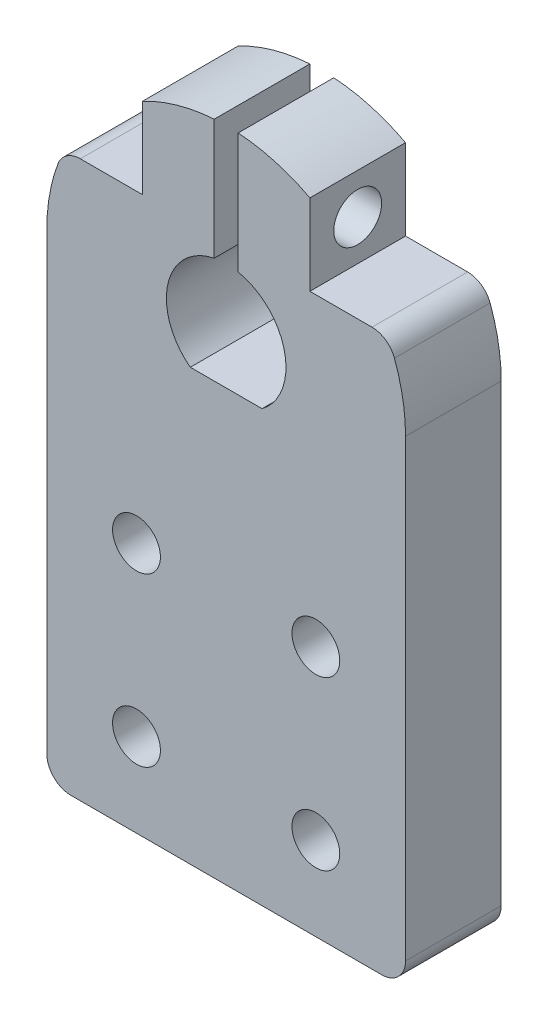
ISO-10303-21;
HEADER;
FILE_DESCRIPTION(('STEP AP214'),'2;1');
FILE_NAME('part.step','',(''),(''),'','','');
FILE_SCHEMA(('AUTOMOTIVE_DESIGN { 1 0 10303 214 1 1 1 1 }'));
ENDSEC;
DATA;
#1=APPLICATION_CONTEXT('core data for automotive mechanical design processes');
#2=APPLICATION_PROTOCOL_DEFINITION('international standard','automotive_design',2000,#1);
#3=PRODUCT_CONTEXT('',#1,'mechanical');
#4=PRODUCT('Part','Part','',(#3));
#5=PRODUCT_RELATED_PRODUCT_CATEGORY('part','',(#4));
#6=PRODUCT_DEFINITION_FORMATION('','',#4);
#7=PRODUCT_DEFINITION_CONTEXT('part definition',#1,'design');
#8=PRODUCT_DEFINITION('design','',#6,#7);
#9=PRODUCT_DEFINITION_SHAPE('','',#8);
#10=(LENGTH_UNIT() NAMED_UNIT(*) SI_UNIT(.MILLI.,.METRE.));
#11=(NAMED_UNIT(*) PLANE_ANGLE_UNIT() SI_UNIT($,.RADIAN.));
#12=(NAMED_UNIT(*) SI_UNIT($,.STERADIAN.) SOLID_ANGLE_UNIT());
#13=UNCERTAINTY_MEASURE_WITH_UNIT(LENGTH_MEASURE(1.E-05),#10,'distance_accuracy_value','');
#14=(GEOMETRIC_REPRESENTATION_CONTEXT(3) GLOBAL_UNCERTAINTY_ASSIGNED_CONTEXT((#13)) GLOBAL_UNIT_ASSIGNED_CONTEXT((#10,
#11,#12)) REPRESENTATION_CONTEXT('',''));
#15=CARTESIAN_POINT('',(0.,0.,0.));
#16=DIRECTION('',(0.,0.,1.));
#17=DIRECTION('',(1.,0.,0.));
#18=AXIS2_PLACEMENT_3D('',#15,#16,#17);
#19=CARTESIAN_POINT('',(0.,0.,8.));
#20=DIRECTION('',(0.,0.,-1.));
#21=DIRECTION('',(-1.,0.,0.));
#22=AXIS2_PLACEMENT_3D('',#19,#20,#21);
#23=CYLINDRICAL_SURFACE('',#22,15.);
#24=CARTESIAN_POINT('',(0.,0.,8.));
#25=DIRECTION('',(0.,0.,1.));
#26=DIRECTION('',(1.,0.,0.));
#27=AXIS2_PLACEMENT_3D('',#24,#25,#26);
#28=CIRCLE('',#27,15.);
#29=CARTESIAN_POINT('',(-14.0726664434428,5.19230769230769,8.));
#30=VERTEX_POINT('',#29);
#31=CARTESIAN_POINT('',(-15.,0.,8.));
#32=VERTEX_POINT('',#31);
#33=EDGE_CURVE('E176',#30,#32,#28,.T.);
#34=ORIENTED_EDGE('',*,*,#33,.F.);
#35=DIRECTION('',(0.,0.,-1.));
#36=VECTOR('',#35,1.);
#37=CARTESIAN_POINT('',(-14.0726664434428,5.19230769230769,8.));
#38=LINE('',#37,#36);
#39=CARTESIAN_POINT('',(-14.0726664434428,5.19230769230769,0.));
#40=VERTEX_POINT('',#39);
#41=EDGE_CURVE('E245',#30,#40,#38,.T.);
#42=ORIENTED_EDGE('',*,*,#41,.T.);
#43=CARTESIAN_POINT('',(0.,0.,0.));
#44=DIRECTION('',(0.,0.,1.));
#45=DIRECTION('',(1.,0.,0.));
#46=AXIS2_PLACEMENT_3D('',#43,#44,#45);
#47=CIRCLE('',#46,15.);
#48=CARTESIAN_POINT('',(-15.,0.,0.));
#49=VERTEX_POINT('',#48);
#50=EDGE_CURVE('E199',#40,#49,#47,.T.);
#51=ORIENTED_EDGE('',*,*,#50,.T.);
#52=DIRECTION('',(0.,0.,-1.));
#53=VECTOR('',#52,1.);
#54=CARTESIAN_POINT('',(-15.,0.,8.));
#55=LINE('',#54,#53);
#56=EDGE_CURVE('E194',#32,#49,#55,.T.);
#57=ORIENTED_EDGE('',*,*,#56,.F.);
#58=EDGE_LOOP('',(#34,#42,#51,#57));
#59=FACE_BOUND('',#58,.T.);
#60=ADVANCED_FACE('F37',(#59),#23,.T.);
#61=CARTESIAN_POINT('',(-15.,-25.,8.));
#62=DIRECTION('',(1.,0.,0.));
#63=DIRECTION('',(0.,1.,0.));
#64=AXIS2_PLACEMENT_3D('',#61,#62,#63);
#65=PLANE('',#64);
#66=DIRECTION('',(0.,-1.,0.));
#67=VECTOR('',#66,1.);
#68=CARTESIAN_POINT('',(-15.,-25.,0.));
#69=LINE('',#68,#67);
#70=CARTESIAN_POINT('',(-15.,-38.,0.));
#71=VERTEX_POINT('',#70);
#72=EDGE_CURVE('E266',#49,#71,#69,.T.);
#73=ORIENTED_EDGE('',*,*,#72,.T.);
#74=DIRECTION('',(0.,0.,-1.));
#75=VECTOR('',#74,1.);
#76=CARTESIAN_POINT('',(-15.,-38.,8.));
#77=LINE('',#76,#75);
#78=CARTESIAN_POINT('',(-15.,-38.,8.));
#79=VERTEX_POINT('',#78);
#80=EDGE_CURVE('E45',#71,#79,#77,.F.);
#81=ORIENTED_EDGE('',*,*,#80,.T.);
#82=DIRECTION('',(0.,-1.,0.));
#83=VECTOR('',#82,1.);
#84=CARTESIAN_POINT('',(-15.,0.,8.));
#85=LINE('',#84,#83);
#86=EDGE_CURVE('E180',#32,#79,#85,.T.);
#87=ORIENTED_EDGE('',*,*,#86,.F.);
#88=ORIENTED_EDGE('',*,*,#56,.T.);
#89=EDGE_LOOP('',(#73,#81,#87,#88));
#90=FACE_BOUND('',#89,.T.);
#91=ADVANCED_FACE('F193',(#90),#65,.F.);
#92=CARTESIAN_POINT('',(-15.,-40.,8.));
#93=DIRECTION('',(0.,1.,0.));
#94=DIRECTION('',(0.,0.,1.));
#95=AXIS2_PLACEMENT_3D('',#92,#93,#94);
#96=PLANE('',#95);
#97=DIRECTION('',(1.,0.,0.));
#98=VECTOR('',#97,1.);
#99=CARTESIAN_POINT('',(-15.,-40.,8.));
#100=LINE('',#99,#98);
#101=CARTESIAN_POINT('',(-13.,-40.,8.));
#102=VERTEX_POINT('',#101);
#103=CARTESIAN_POINT('',(13.,-40.,8.));
#104=VERTEX_POINT('',#103);
#105=EDGE_CURVE('E196',#102,#104,#100,.T.);
#106=ORIENTED_EDGE('',*,*,#105,.F.);
#107=DIRECTION('',(0.,0.,-1.));
#108=VECTOR('',#107,1.);
#109=CARTESIAN_POINT('',(-13.,-40.,8.));
#110=LINE('',#109,#108);
#111=CARTESIAN_POINT('',(-13.,-40.,0.));
#112=VERTEX_POINT('',#111);
#113=EDGE_CURVE('E250',#102,#112,#110,.T.);
#114=ORIENTED_EDGE('',*,*,#113,.T.);
#115=DIRECTION('',(1.,0.,0.));
#116=VECTOR('',#115,1.);
#117=CARTESIAN_POINT('',(-15.,-40.,0.));
#118=LINE('',#117,#116);
#119=CARTESIAN_POINT('',(13.,-40.,0.));
#120=VERTEX_POINT('',#119);
#121=EDGE_CURVE('E258',#112,#120,#118,.T.);
#122=ORIENTED_EDGE('',*,*,#121,.T.);
#123=DIRECTION('',(0.,0.,-1.));
#124=VECTOR('',#123,1.);
#125=CARTESIAN_POINT('',(13.,-40.,8.));
#126=LINE('',#125,#124);
#127=EDGE_CURVE('E248',#120,#104,#126,.F.);
#128=ORIENTED_EDGE('',*,*,#127,.T.);
#129=EDGE_LOOP('',(#106,#114,#122,#128));
#130=FACE_BOUND('',#129,.T.);
#131=ADVANCED_FACE('F257',(#130),#96,.F.);
#132=CARTESIAN_POINT('',(15.,-40.,8.));
#133=DIRECTION('',(-1.,0.,0.));
#134=DIRECTION('',(0.,-1.,0.));
#135=AXIS2_PLACEMENT_3D('',#132,#133,#134);
#136=PLANE('',#135);
#137=DIRECTION('',(0.,1.,0.));
#138=VECTOR('',#137,1.);
#139=CARTESIAN_POINT('',(15.,-40.,8.));
#140=LINE('',#139,#138);
#141=CARTESIAN_POINT('',(15.,-38.,8.));
#142=VERTEX_POINT('',#141);
#143=CARTESIAN_POINT('',(15.,0.,8.));
#144=VERTEX_POINT('',#143);
#145=EDGE_CURVE('E373',#142,#144,#140,.T.);
#146=ORIENTED_EDGE('',*,*,#145,.F.);
#147=DIRECTION('',(0.,0.,-1.));
#148=VECTOR('',#147,1.);
#149=CARTESIAN_POINT('',(15.,-38.,8.));
#150=LINE('',#149,#148);
#151=CARTESIAN_POINT('',(15.,-38.,0.));
#152=VERTEX_POINT('',#151);
#153=EDGE_CURVE('E11',#142,#152,#150,.T.);
#154=ORIENTED_EDGE('',*,*,#153,.T.);
#155=DIRECTION('',(0.,1.,0.));
#156=VECTOR('',#155,1.);
#157=CARTESIAN_POINT('',(15.,-40.,0.));
#158=LINE('',#157,#156);
#159=CARTESIAN_POINT('',(15.,0.,0.));
#160=VERTEX_POINT('',#159);
#161=EDGE_CURVE('E265',#152,#160,#158,.T.);
#162=ORIENTED_EDGE('',*,*,#161,.T.);
#163=DIRECTION('',(0.,0.,-1.));
#164=VECTOR('',#163,1.);
#165=CARTESIAN_POINT('',(15.,0.,8.));
#166=LINE('',#165,#164);
#167=EDGE_CURVE('E202',#144,#160,#166,.T.);
#168=ORIENTED_EDGE('',*,*,#167,.F.);
#169=EDGE_LOOP('',(#146,#154,#162,#168));
#170=FACE_BOUND('',#169,.T.);
#171=ADVANCED_FACE('F390',(#170),#136,.F.);
#172=CARTESIAN_POINT('',(0.,0.,8.));
#173=DIRECTION('',(0.,0.,-1.));
#174=DIRECTION('',(-1.,0.,0.));
#175=AXIS2_PLACEMENT_3D('',#172,#173,#174);
#176=CYLINDRICAL_SURFACE('',#175,15.);
#177=CARTESIAN_POINT('',(0.,0.,0.));
#178=DIRECTION('',(0.,0.,1.));
#179=DIRECTION('',(1.,0.,0.));
#180=AXIS2_PLACEMENT_3D('',#177,#178,#179);
#181=CIRCLE('',#180,15.);
#182=CARTESIAN_POINT('',(14.0726664434428,5.19230769230769,0.));
#183=VERTEX_POINT('',#182);
#184=EDGE_CURVE('E268',#160,#183,#181,.T.);
#185=ORIENTED_EDGE('',*,*,#184,.T.);
#186=DIRECTION('',(0.,0.,-1.));
#187=VECTOR('',#186,1.);
#188=CARTESIAN_POINT('',(14.0726664434428,5.19230769230769,8.));
#189=LINE('',#188,#187);
#190=CARTESIAN_POINT('',(14.0726664434428,5.19230769230769,8.));
#191=VERTEX_POINT('',#190);
#192=EDGE_CURVE('E237',#183,#191,#189,.F.);
#193=ORIENTED_EDGE('',*,*,#192,.T.);
#194=CARTESIAN_POINT('',(0.,0.,8.));
#195=DIRECTION('',(0.,0.,1.));
#196=DIRECTION('',(1.,0.,0.));
#197=AXIS2_PLACEMENT_3D('',#194,#195,#196);
#198=CIRCLE('',#197,15.);
#199=EDGE_CURVE('E375',#144,#191,#198,.T.);
#200=ORIENTED_EDGE('',*,*,#199,.F.);
#201=ORIENTED_EDGE('',*,*,#167,.T.);
#202=EDGE_LOOP('',(#185,#193,#200,#201));
#203=FACE_BOUND('',#202,.T.);
#204=ADVANCED_FACE('F386',(#203),#176,.T.);
#205=CARTESIAN_POINT('',(7.,6.5,8.));
#206=DIRECTION('',(0.,-1.,0.));
#207=DIRECTION('',(0.,0.,-1.));
#208=AXIS2_PLACEMENT_3D('',#205,#206,#207);
#209=PLANE('',#208);
#210=DIRECTION('',(-1.,0.,0.));
#211=VECTOR('',#210,1.);
#212=CARTESIAN_POINT('',(7.,6.5,8.));
#213=LINE('',#212,#211);
#214=CARTESIAN_POINT('',(12.1963109176505,6.5,8.));
#215=VERTEX_POINT('',#214);
#216=CARTESIAN_POINT('',(7.,6.5,8.));
#217=VERTEX_POINT('',#216);
#218=EDGE_CURVE('E377',#215,#217,#213,.T.);
#219=ORIENTED_EDGE('',*,*,#218,.F.);
#220=DIRECTION('',(0.,0.,-1.));
#221=VECTOR('',#220,1.);
#222=CARTESIAN_POINT('',(12.1963109176505,6.5,8.));
#223=LINE('',#222,#221);
#224=CARTESIAN_POINT('',(12.1963109176505,6.5,0.));
#225=VERTEX_POINT('',#224);
#226=EDGE_CURVE('E201',#215,#225,#223,.T.);
#227=ORIENTED_EDGE('',*,*,#226,.T.);
#228=DIRECTION('',(-1.,0.,0.));
#229=VECTOR('',#228,1.);
#230=CARTESIAN_POINT('',(7.,6.5,0.));
#231=LINE('',#230,#229);
#232=CARTESIAN_POINT('',(7.,6.5,0.));
#233=VERTEX_POINT('',#232);
#234=EDGE_CURVE('E275',#225,#233,#231,.T.);
#235=ORIENTED_EDGE('',*,*,#234,.T.);
#236=DIRECTION('',(0.,0.,-1.));
#237=VECTOR('',#236,1.);
#238=CARTESIAN_POINT('',(7.,6.5,8.));
#239=LINE('',#238,#237);
#240=EDGE_CURVE('E208',#217,#233,#239,.T.);
#241=ORIENTED_EDGE('',*,*,#240,.F.);
#242=EDGE_LOOP('',(#219,#227,#235,#241));
#243=FACE_BOUND('',#242,.T.);
#244=ADVANCED_FACE('F380',(#243),#209,.F.);
#245=CARTESIAN_POINT('',(7.,6.5,8.));
#246=DIRECTION('',(-1.,0.,0.));
#247=DIRECTION('',(0.,0.,1.));
#248=AXIS2_PLACEMENT_3D('',#245,#246,#247);
#249=PLANE('',#248);
#250=CARTESIAN_POINT('',(7.,9.8832495807108,4.));
#251=DIRECTION('',(1.,0.,0.));
#252=DIRECTION('',(0.,0.,-1.));
#253=AXIS2_PLACEMENT_3D('',#250,#251,#252);
#254=CIRCLE('',#253,2.);
#255=CARTESIAN_POINT('',(7.,9.8832495807108,2.));
#256=VERTEX_POINT('',#255);
#257=EDGE_CURVE('E216',#256,#256,#254,.T.);
#258=ORIENTED_EDGE('',*,*,#257,.F.);
#259=EDGE_LOOP('',(#258));
#260=FACE_BOUND('',#259,.T.);
#261=DIRECTION('',(0.,1.,0.));
#262=VECTOR('',#261,1.);
#263=CARTESIAN_POINT('',(7.,6.5,0.));
#264=LINE('',#263,#262);
#265=CARTESIAN_POINT('',(7.,13.2664991614216,0.));
#266=VERTEX_POINT('',#265);
#267=EDGE_CURVE('E277',#233,#266,#264,.T.);
#268=ORIENTED_EDGE('',*,*,#267,.T.);
#269=DIRECTION('',(0.,0.,-1.));
#270=VECTOR('',#269,1.);
#271=CARTESIAN_POINT('',(7.,13.2664991614216,8.));
#272=LINE('',#271,#270);
#273=CARTESIAN_POINT('',(7.,13.2664991614216,8.));
#274=VERTEX_POINT('',#273);
#275=EDGE_CURVE('E321',#274,#266,#272,.T.);
#276=ORIENTED_EDGE('',*,*,#275,.F.);
#277=DIRECTION('',(0.,1.,0.));
#278=VECTOR('',#277,1.);
#279=CARTESIAN_POINT('',(7.,6.5,8.));
#280=LINE('',#279,#278);
#281=EDGE_CURVE('E330',#217,#274,#280,.T.);
#282=ORIENTED_EDGE('',*,*,#281,.F.);
#283=ORIENTED_EDGE('',*,*,#240,.T.);
#284=EDGE_LOOP('',(#268,#276,#282,#283));
#285=FACE_BOUND('',#284,.T.);
#286=ADVANCED_FACE('F328',(#260,#285),#249,.F.);
#287=CARTESIAN_POINT('',(0.,0.,8.));
#288=DIRECTION('',(0.,0.,-1.));
#289=DIRECTION('',(-1.,0.,0.));
#290=AXIS2_PLACEMENT_3D('',#287,#288,#289);
#291=CYLINDRICAL_SURFACE('',#290,15.);
#292=CARTESIAN_POINT('',(0.,0.,0.));
#293=DIRECTION('',(0.,0.,1.));
#294=DIRECTION('',(1.,0.,0.));
#295=AXIS2_PLACEMENT_3D('',#292,#293,#294);
#296=CIRCLE('',#295,15.);
#297=CARTESIAN_POINT('',(1.,14.9666295470958,0.));
#298=VERTEX_POINT('',#297);
#299=EDGE_CURVE('E279',#266,#298,#296,.T.);
#300=ORIENTED_EDGE('',*,*,#299,.T.);
#301=DIRECTION('',(0.,0.,-1.));
#302=VECTOR('',#301,1.);
#303=CARTESIAN_POINT('',(1.,14.9666295470958,8.));
#304=LINE('',#303,#302);
#305=CARTESIAN_POINT('',(1.,14.9666295470958,8.));
#306=VERTEX_POINT('',#305);
#307=EDGE_CURVE('E318',#306,#298,#304,.T.);
#308=ORIENTED_EDGE('',*,*,#307,.F.);
#309=CARTESIAN_POINT('',(0.,0.,8.));
#310=DIRECTION('',(0.,0.,1.));
#311=DIRECTION('',(1.,0.,0.));
#312=AXIS2_PLACEMENT_3D('',#309,#310,#311);
#313=CIRCLE('',#312,15.);
#314=EDGE_CURVE('E347',#274,#306,#313,.T.);
#315=ORIENTED_EDGE('',*,*,#314,.F.);
#316=ORIENTED_EDGE('',*,*,#275,.T.);
#317=EDGE_LOOP('',(#300,#308,#315,#316));
#318=FACE_BOUND('',#317,.T.);
#319=ADVANCED_FACE('F338',(#318),#291,.T.);
#320=CARTESIAN_POINT('',(1.,4.89897948556636,8.));
#321=DIRECTION('',(1.,0.,0.));
#322=DIRECTION('',(0.,0.,-1.));
#323=AXIS2_PLACEMENT_3D('',#320,#321,#322);
#324=PLANE('',#323);
#325=CARTESIAN_POINT('',(1.,9.8832495807108,4.));
#326=DIRECTION('',(1.,0.,0.));
#327=DIRECTION('',(0.,0.,-1.));
#328=AXIS2_PLACEMENT_3D('',#325,#326,#327);
#329=CIRCLE('',#328,2.);
#330=CARTESIAN_POINT('',(1.,9.8832495807108,2.));
#331=VERTEX_POINT('',#330);
#332=EDGE_CURVE('E363',#331,#331,#329,.T.);
#333=ORIENTED_EDGE('',*,*,#332,.T.);
#334=EDGE_LOOP('',(#333));
#335=FACE_BOUND('',#334,.T.);
#336=DIRECTION('',(0.,-1.,0.));
#337=VECTOR('',#336,1.);
#338=CARTESIAN_POINT('',(1.,4.89897948556636,0.));
#339=LINE('',#338,#337);
#340=CARTESIAN_POINT('',(1.,4.89897948556636,0.));
#341=VERTEX_POINT('',#340);
#342=EDGE_CURVE('E281',#298,#341,#339,.T.);
#343=ORIENTED_EDGE('',*,*,#342,.T.);
#344=DIRECTION('',(0.,0.,-1.));
#345=VECTOR('',#344,1.);
#346=CARTESIAN_POINT('',(1.,4.89897948556636,8.));
#347=LINE('',#346,#345);
#348=CARTESIAN_POINT('',(1.,4.89897948556636,8.));
#349=VERTEX_POINT('',#348);
#350=EDGE_CURVE('E315',#349,#341,#347,.T.);
#351=ORIENTED_EDGE('',*,*,#350,.F.);
#352=DIRECTION('',(0.,-1.,0.));
#353=VECTOR('',#352,1.);
#354=CARTESIAN_POINT('',(1.,4.89897948556636,8.));
#355=LINE('',#354,#353);
#356=EDGE_CURVE('E344',#306,#349,#355,.T.);
#357=ORIENTED_EDGE('',*,*,#356,.F.);
#358=ORIENTED_EDGE('',*,*,#307,.T.);
#359=EDGE_LOOP('',(#343,#351,#357,#358));
#360=FACE_BOUND('',#359,.T.);
#361=ADVANCED_FACE('F342',(#335,#360),#324,.F.);
#362=CARTESIAN_POINT('',(0.,0.,8.));
#363=DIRECTION('',(0.,0.,-1.));
#364=DIRECTION('',(-1.,0.,0.));
#365=AXIS2_PLACEMENT_3D('',#362,#363,#364);
#366=CYLINDRICAL_SURFACE('',#365,5.);
#367=CARTESIAN_POINT('',(0.,0.,0.));
#368=DIRECTION('',(0.,0.,-1.));
#369=DIRECTION('',(1.,0.,0.));
#370=AXIS2_PLACEMENT_3D('',#367,#368,#369);
#371=CIRCLE('',#370,5.);
#372=CARTESIAN_POINT('',(3.,-4.,0.));
#373=VERTEX_POINT('',#372);
#374=EDGE_CURVE('E283',#341,#373,#371,.T.);
#375=ORIENTED_EDGE('',*,*,#374,.T.);
#376=DIRECTION('',(0.,0.,-1.));
#377=VECTOR('',#376,1.);
#378=CARTESIAN_POINT('',(3.,-4.,8.));
#379=LINE('',#378,#377);
#380=CARTESIAN_POINT('',(3.,-4.,8.));
#381=VERTEX_POINT('',#380);
#382=EDGE_CURVE('E312',#381,#373,#379,.T.);
#383=ORIENTED_EDGE('',*,*,#382,.F.);
#384=CARTESIAN_POINT('',(0.,0.,8.));
#385=DIRECTION('',(0.,0.,-1.));
#386=DIRECTION('',(1.,0.,0.));
#387=AXIS2_PLACEMENT_3D('',#384,#385,#386);
#388=CIRCLE('',#387,5.);
#389=EDGE_CURVE('E346',#349,#381,#388,.T.);
#390=ORIENTED_EDGE('',*,*,#389,.F.);
#391=ORIENTED_EDGE('',*,*,#350,.T.);
#392=EDGE_LOOP('',(#375,#383,#390,#391));
#393=FACE_BOUND('',#392,.T.);
#394=ADVANCED_FACE('F465',(#393),#366,.F.);
#395=CARTESIAN_POINT('',(-3.,-4.,8.));
#396=DIRECTION('',(0.,-1.,0.));
#397=DIRECTION('',(0.,0.,-1.));
#398=AXIS2_PLACEMENT_3D('',#395,#396,#397);
#399=PLANE('',#398);
#400=DIRECTION('',(-1.,0.,0.));
#401=VECTOR('',#400,1.);
#402=CARTESIAN_POINT('',(-3.,-4.,0.));
#403=LINE('',#402,#401);
#404=CARTESIAN_POINT('',(-3.,-4.,0.));
#405=VERTEX_POINT('',#404);
#406=EDGE_CURVE('E285',#373,#405,#403,.T.);
#407=ORIENTED_EDGE('',*,*,#406,.T.);
#408=DIRECTION('',(0.,0.,-1.));
#409=VECTOR('',#408,1.);
#410=CARTESIAN_POINT('',(-3.,-4.,8.));
#411=LINE('',#410,#409);
#412=CARTESIAN_POINT('',(-3.,-4.,8.));
#413=VERTEX_POINT('',#412);
#414=EDGE_CURVE('E309',#413,#405,#411,.T.);
#415=ORIENTED_EDGE('',*,*,#414,.F.);
#416=DIRECTION('',(-1.,0.,0.));
#417=VECTOR('',#416,1.);
#418=CARTESIAN_POINT('',(-3.,-4.,8.));
#419=LINE('',#418,#417);
#420=EDGE_CURVE('E349',#381,#413,#419,.T.);
#421=ORIENTED_EDGE('',*,*,#420,.F.);
#422=ORIENTED_EDGE('',*,*,#382,.T.);
#423=EDGE_LOOP('',(#407,#415,#421,#422));
#424=FACE_BOUND('',#423,.T.);
#425=ADVANCED_FACE('F461',(#424),#399,.F.);
#426=CARTESIAN_POINT('',(0.,0.,8.));
#427=DIRECTION('',(0.,0.,-1.));
#428=DIRECTION('',(-1.,0.,0.));
#429=AXIS2_PLACEMENT_3D('',#426,#427,#428);
#430=CYLINDRICAL_SURFACE('',#429,5.);
#431=CARTESIAN_POINT('',(0.,0.,0.));
#432=DIRECTION('',(0.,0.,-1.));
#433=DIRECTION('',(1.,0.,0.));
#434=AXIS2_PLACEMENT_3D('',#431,#432,#433);
#435=CIRCLE('',#434,5.);
#436=CARTESIAN_POINT('',(-1.,4.89897948556636,0.));
#437=VERTEX_POINT('',#436);
#438=EDGE_CURVE('E287',#405,#437,#435,.T.);
#439=ORIENTED_EDGE('',*,*,#438,.T.);
#440=DIRECTION('',(0.,0.,-1.));
#441=VECTOR('',#440,1.);
#442=CARTESIAN_POINT('',(-1.,4.89897948556636,8.));
#443=LINE('',#442,#441);
#444=CARTESIAN_POINT('',(-1.,4.89897948556636,8.));
#445=VERTEX_POINT('',#444);
#446=EDGE_CURVE('E306',#445,#437,#443,.T.);
#447=ORIENTED_EDGE('',*,*,#446,.F.);
#448=CARTESIAN_POINT('',(0.,0.,8.));
#449=DIRECTION('',(0.,0.,-1.));
#450=DIRECTION('',(1.,0.,0.));
#451=AXIS2_PLACEMENT_3D('',#448,#449,#450);
#452=CIRCLE('',#451,5.);
#453=EDGE_CURVE('E355',#413,#445,#452,.T.);
#454=ORIENTED_EDGE('',*,*,#453,.F.);
#455=ORIENTED_EDGE('',*,*,#414,.T.);
#456=EDGE_LOOP('',(#439,#447,#454,#455));
#457=FACE_BOUND('',#456,.T.);
#458=ADVANCED_FACE('F457',(#457),#430,.F.);
#459=CARTESIAN_POINT('',(-1.,4.89897948556636,8.));
#460=DIRECTION('',(-1.,0.,0.));
#461=DIRECTION('',(0.,0.,1.));
#462=AXIS2_PLACEMENT_3D('',#459,#460,#461);
#463=PLANE('',#462);
#464=CARTESIAN_POINT('',(-1.,9.8832495807108,4.));
#465=DIRECTION('',(-1.,0.,0.));
#466=DIRECTION('',(0.,0.,1.));
#467=AXIS2_PLACEMENT_3D('',#464,#465,#466);
#468=CIRCLE('',#467,2.);
#469=CARTESIAN_POINT('',(-1.,9.8832495807108,6.));
#470=VERTEX_POINT('',#469);
#471=EDGE_CURVE('E215',#470,#470,#468,.T.);
#472=ORIENTED_EDGE('',*,*,#471,.T.);
#473=EDGE_LOOP('',(#472));
#474=FACE_BOUND('',#473,.T.);
#475=DIRECTION('',(0.,1.,0.));
#476=VECTOR('',#475,1.);
#477=CARTESIAN_POINT('',(-1.,4.89897948556636,0.));
#478=LINE('',#477,#476);
#479=CARTESIAN_POINT('',(-1.,14.9666295470958,0.));
#480=VERTEX_POINT('',#479);
#481=EDGE_CURVE('E289',#437,#480,#478,.T.);
#482=ORIENTED_EDGE('',*,*,#481,.T.);
#483=DIRECTION('',(0.,0.,-1.));
#484=VECTOR('',#483,1.);
#485=CARTESIAN_POINT('',(-1.,14.9666295470958,8.));
#486=LINE('',#485,#484);
#487=CARTESIAN_POINT('',(-1.,14.9666295470958,8.));
#488=VERTEX_POINT('',#487);
#489=EDGE_CURVE('E303',#488,#480,#486,.T.);
#490=ORIENTED_EDGE('',*,*,#489,.F.);
#491=DIRECTION('',(0.,1.,0.));
#492=VECTOR('',#491,1.);
#493=CARTESIAN_POINT('',(-1.,4.89897948556636,8.));
#494=LINE('',#493,#492);
#495=EDGE_CURVE('E357',#445,#488,#494,.T.);
#496=ORIENTED_EDGE('',*,*,#495,.F.);
#497=ORIENTED_EDGE('',*,*,#446,.T.);
#498=EDGE_LOOP('',(#482,#490,#496,#497));
#499=FACE_BOUND('',#498,.T.);
#500=ADVANCED_FACE('F453',(#474,#499),#463,.F.);
#501=CARTESIAN_POINT('',(0.,0.,8.));
#502=DIRECTION('',(0.,0.,-1.));
#503=DIRECTION('',(-1.,0.,0.));
#504=AXIS2_PLACEMENT_3D('',#501,#502,#503);
#505=CYLINDRICAL_SURFACE('',#504,15.);
#506=CARTESIAN_POINT('',(0.,0.,0.));
#507=DIRECTION('',(0.,0.,1.));
#508=DIRECTION('',(1.,0.,0.));
#509=AXIS2_PLACEMENT_3D('',#506,#507,#508);
#510=CIRCLE('',#509,15.);
#511=CARTESIAN_POINT('',(-7.,13.2664991614216,0.));
#512=VERTEX_POINT('',#511);
#513=EDGE_CURVE('E291',#480,#512,#510,.T.);
#514=ORIENTED_EDGE('',*,*,#513,.T.);
#515=DIRECTION('',(0.,0.,-1.));
#516=VECTOR('',#515,1.);
#517=CARTESIAN_POINT('',(-7.,13.2664991614216,8.));
#518=LINE('',#517,#516);
#519=CARTESIAN_POINT('',(-7.,13.2664991614216,8.));
#520=VERTEX_POINT('',#519);
#521=EDGE_CURVE('E299',#520,#512,#518,.T.);
#522=ORIENTED_EDGE('',*,*,#521,.F.);
#523=CARTESIAN_POINT('',(0.,0.,8.));
#524=DIRECTION('',(0.,0.,1.));
#525=DIRECTION('',(1.,0.,0.));
#526=AXIS2_PLACEMENT_3D('',#523,#524,#525);
#527=CIRCLE('',#526,15.);
#528=EDGE_CURVE('E359',#488,#520,#527,.T.);
#529=ORIENTED_EDGE('',*,*,#528,.F.);
#530=ORIENTED_EDGE('',*,*,#489,.T.);
#531=EDGE_LOOP('',(#514,#522,#529,#530));
#532=FACE_BOUND('',#531,.T.);
#533=ADVANCED_FACE('F449',(#532),#505,.T.);
#534=CARTESIAN_POINT('',(-7.,6.5,8.));
#535=DIRECTION('',(1.,0.,0.));
#536=DIRECTION('',(0.,0.,-1.));
#537=AXIS2_PLACEMENT_3D('',#534,#535,#536);
#538=PLANE('',#537);
#539=CARTESIAN_POINT('',(-7.,9.8832495807108,4.));
#540=DIRECTION('',(1.,0.,0.));
#541=DIRECTION('',(0.,0.,-1.));
#542=AXIS2_PLACEMENT_3D('',#539,#540,#541);
#543=CIRCLE('',#542,2.);
#544=CARTESIAN_POINT('',(-7.,9.8832495807108,2.));
#545=VERTEX_POINT('',#544);
#546=EDGE_CURVE('E212',#545,#545,#543,.T.);
#547=ORIENTED_EDGE('',*,*,#546,.T.);
#548=EDGE_LOOP('',(#547));
#549=FACE_BOUND('',#548,.T.);
#550=DIRECTION('',(0.,-1.,0.));
#551=VECTOR('',#550,1.);
#552=CARTESIAN_POINT('',(-7.,6.5,0.));
#553=LINE('',#552,#551);
#554=CARTESIAN_POINT('',(-7.,6.5,0.));
#555=VERTEX_POINT('',#554);
#556=EDGE_CURVE('E293',#512,#555,#553,.T.);
#557=ORIENTED_EDGE('',*,*,#556,.T.);
#558=DIRECTION('',(0.,0.,-1.));
#559=VECTOR('',#558,1.);
#560=CARTESIAN_POINT('',(-7.,6.5,8.));
#561=LINE('',#560,#559);
#562=CARTESIAN_POINT('',(-7.,6.5,8.));
#563=VERTEX_POINT('',#562);
#564=EDGE_CURVE('E296',#563,#555,#561,.T.);
#565=ORIENTED_EDGE('',*,*,#564,.F.);
#566=DIRECTION('',(0.,-1.,0.));
#567=VECTOR('',#566,1.);
#568=CARTESIAN_POINT('',(-7.,6.5,8.));
#569=LINE('',#568,#567);
#570=EDGE_CURVE('E361',#520,#563,#569,.T.);
#571=ORIENTED_EDGE('',*,*,#570,.F.);
#572=ORIENTED_EDGE('',*,*,#521,.T.);
#573=EDGE_LOOP('',(#557,#565,#571,#572));
#574=FACE_BOUND('',#573,.T.);
#575=ADVANCED_FACE('F446',(#549,#574),#538,.F.);
#576=CARTESIAN_POINT('',(-7.,6.5,8.));
#577=DIRECTION('',(0.,-1.,0.));
#578=DIRECTION('',(0.,0.,-1.));
#579=AXIS2_PLACEMENT_3D('',#576,#577,#578);
#580=PLANE('',#579);
#581=DIRECTION('',(-1.,0.,0.));
#582=VECTOR('',#581,1.);
#583=CARTESIAN_POINT('',(-7.,6.5,0.));
#584=LINE('',#583,#582);
#585=CARTESIAN_POINT('',(-12.1963109176505,6.5,0.));
#586=VERTEX_POINT('',#585);
#587=EDGE_CURVE('E188',#555,#586,#584,.T.);
#588=ORIENTED_EDGE('',*,*,#587,.T.);
#589=DIRECTION('',(0.,0.,-1.));
#590=VECTOR('',#589,1.);
#591=CARTESIAN_POINT('',(-12.1963109176505,6.5,8.));
#592=LINE('',#591,#590);
#593=CARTESIAN_POINT('',(-12.1963109176505,6.5,8.));
#594=VERTEX_POINT('',#593);
#595=EDGE_CURVE('E52',#586,#594,#592,.F.);
#596=ORIENTED_EDGE('',*,*,#595,.T.);
#597=DIRECTION('',(-1.,0.,0.));
#598=VECTOR('',#597,1.);
#599=CARTESIAN_POINT('',(-7.,6.5,8.));
#600=LINE('',#599,#598);
#601=EDGE_CURVE('E300',#563,#594,#600,.T.);
#602=ORIENTED_EDGE('',*,*,#601,.F.);
#603=ORIENTED_EDGE('',*,*,#564,.T.);
#604=EDGE_LOOP('',(#588,#596,#602,#603));
#605=FACE_BOUND('',#604,.T.);
#606=ADVANCED_FACE('F439',(#605),#580,.F.);
#607=CARTESIAN_POINT('',(0.,0.,8.));
#608=DIRECTION('',(0.,0.,1.));
#609=DIRECTION('',(1.,0.,0.));
#610=AXIS2_PLACEMENT_3D('',#607,#608,#609);
#611=PLANE('',#610);
#612=CARTESIAN_POINT('',(7.5,-33.,8.));
#613=DIRECTION('',(0.,0.,1.));
#614=DIRECTION('',(1.,0.,0.));
#615=AXIS2_PLACEMENT_3D('',#612,#613,#614);
#616=CIRCLE('',#615,2.);
#617=CARTESIAN_POINT('',(9.5,-33.,8.));
#618=VERTEX_POINT('',#617);
#619=EDGE_CURVE('E665',#618,#618,#616,.T.);
#620=ORIENTED_EDGE('',*,*,#619,.F.);
#621=EDGE_LOOP('',(#620));
#622=FACE_BOUND('',#621,.T.);
#623=CARTESIAN_POINT('',(7.5,-19.,8.));
#624=DIRECTION('',(0.,0.,1.));
#625=DIRECTION('',(1.,0.,0.));
#626=AXIS2_PLACEMENT_3D('',#623,#624,#625);
#627=CIRCLE('',#626,2.);
#628=CARTESIAN_POINT('',(9.5,-19.,8.));
#629=VERTEX_POINT('',#628);
#630=EDGE_CURVE('E660',#629,#629,#627,.T.);
#631=ORIENTED_EDGE('',*,*,#630,.F.);
#632=EDGE_LOOP('',(#631));
#633=FACE_BOUND('',#632,.T.);
#634=CARTESIAN_POINT('',(-7.5,-19.,8.));
#635=DIRECTION('',(0.,0.,1.));
#636=DIRECTION('',(-1.,0.,0.));
#637=AXIS2_PLACEMENT_3D('',#634,#635,#636);
#638=CIRCLE('',#637,2.);
#639=CARTESIAN_POINT('',(-9.5,-19.,8.));
#640=VERTEX_POINT('',#639);
#641=EDGE_CURVE('E653',#640,#640,#638,.T.);
#642=ORIENTED_EDGE('',*,*,#641,.F.);
#643=EDGE_LOOP('',(#642));
#644=FACE_BOUND('',#643,.T.);
#645=CARTESIAN_POINT('',(-7.5,-33.,8.));
#646=DIRECTION('',(0.,0.,1.));
#647=DIRECTION('',(-1.,0.,0.));
#648=AXIS2_PLACEMENT_3D('',#645,#646,#647);
#649=CIRCLE('',#648,2.);
#650=CARTESIAN_POINT('',(-9.5,-33.,8.));
#651=VERTEX_POINT('',#650);
#652=EDGE_CURVE('E221',#651,#651,#649,.T.);
#653=ORIENTED_EDGE('',*,*,#652,.F.);
#654=EDGE_LOOP('',(#653));
#655=FACE_BOUND('',#654,.T.);
#656=ORIENTED_EDGE('',*,*,#199,.T.);
#657=CARTESIAN_POINT('',(12.1963109176505,4.5,8.));
#658=DIRECTION('',(0.,0.,1.));
#659=DIRECTION('',(1.,0.,0.));
#660=AXIS2_PLACEMENT_3D('',#657,#658,#659);
#661=CIRCLE('',#660,2.);
#662=EDGE_CURVE('E243',#191,#215,#661,.T.);
#663=ORIENTED_EDGE('',*,*,#662,.T.);
#664=ORIENTED_EDGE('',*,*,#218,.T.);
#665=ORIENTED_EDGE('',*,*,#281,.T.);
#666=ORIENTED_EDGE('',*,*,#314,.T.);
#667=ORIENTED_EDGE('',*,*,#356,.T.);
#668=ORIENTED_EDGE('',*,*,#389,.T.);
#669=ORIENTED_EDGE('',*,*,#420,.T.);
#670=ORIENTED_EDGE('',*,*,#453,.T.);
#671=ORIENTED_EDGE('',*,*,#495,.T.);
#672=ORIENTED_EDGE('',*,*,#528,.T.);
#673=ORIENTED_EDGE('',*,*,#570,.T.);
#674=ORIENTED_EDGE('',*,*,#601,.T.);
#675=CARTESIAN_POINT('',(-12.1963109176505,4.5,8.));
#676=DIRECTION('',(0.,0.,1.));
#677=DIRECTION('',(1.,0.,0.));
#678=AXIS2_PLACEMENT_3D('',#675,#676,#677);
#679=CIRCLE('',#678,2.);
#680=EDGE_CURVE('E183',#594,#30,#679,.T.);
#681=ORIENTED_EDGE('',*,*,#680,.T.);
#682=ORIENTED_EDGE('',*,*,#33,.T.);
#683=ORIENTED_EDGE('',*,*,#86,.T.);
#684=CARTESIAN_POINT('',(-13.,-38.,8.));
#685=DIRECTION('',(0.,0.,1.));
#686=DIRECTION('',(1.,0.,0.));
#687=AXIS2_PLACEMENT_3D('',#684,#685,#686);
#688=CIRCLE('',#687,2.);
#689=EDGE_CURVE('E240',#79,#102,#688,.T.);
#690=ORIENTED_EDGE('',*,*,#689,.T.);
#691=ORIENTED_EDGE('',*,*,#105,.T.);
#692=CARTESIAN_POINT('',(13.,-38.,8.));
#693=DIRECTION('',(0.,0.,1.));
#694=DIRECTION('',(1.,0.,0.));
#695=AXIS2_PLACEMENT_3D('',#692,#693,#694);
#696=CIRCLE('',#695,2.);
#697=EDGE_CURVE('E60',#104,#142,#696,.T.);
#698=ORIENTED_EDGE('',*,*,#697,.T.);
#699=ORIENTED_EDGE('',*,*,#145,.T.);
#700=EDGE_LOOP('',(#656,#663,#664,#665,#666,#667,#668,#669,#670,#671,#672,#673,#674,#681,#682,
#683,#690,#691,#698,#699));
#701=FACE_BOUND('',#700,.T.);
#702=ADVANCED_FACE('F179',(#622,#633,#644,#655,#701),#611,.T.);
#703=CARTESIAN_POINT('',(0.,0.,0.));
#704=DIRECTION('',(0.,0.,1.));
#705=DIRECTION('',(1.,0.,0.));
#706=AXIS2_PLACEMENT_3D('',#703,#704,#705);
#707=PLANE('',#706);
#708=CARTESIAN_POINT('',(7.5,-33.,0.));
#709=DIRECTION('',(0.,0.,1.));
#710=DIRECTION('',(1.,0.,0.));
#711=AXIS2_PLACEMENT_3D('',#708,#709,#710);
#712=CIRCLE('',#711,2.);
#713=CARTESIAN_POINT('',(9.5,-33.,0.));
#714=VERTEX_POINT('',#713);
#715=EDGE_CURVE('E227',#714,#714,#712,.T.);
#716=ORIENTED_EDGE('',*,*,#715,.T.);
#717=EDGE_LOOP('',(#716));
#718=FACE_BOUND('',#717,.T.);
#719=CARTESIAN_POINT('',(7.5,-19.,0.));
#720=DIRECTION('',(0.,0.,1.));
#721=DIRECTION('',(1.,0.,0.));
#722=AXIS2_PLACEMENT_3D('',#719,#720,#721);
#723=CIRCLE('',#722,2.);
#724=CARTESIAN_POINT('',(9.5,-19.,0.));
#725=VERTEX_POINT('',#724);
#726=EDGE_CURVE('E224',#725,#725,#723,.T.);
#727=ORIENTED_EDGE('',*,*,#726,.T.);
#728=EDGE_LOOP('',(#727));
#729=FACE_BOUND('',#728,.T.);
#730=CARTESIAN_POINT('',(-7.5,-19.,0.));
#731=DIRECTION('',(0.,0.,1.));
#732=DIRECTION('',(1.,0.,0.));
#733=AXIS2_PLACEMENT_3D('',#730,#731,#732);
#734=CIRCLE('',#733,2.);
#735=CARTESIAN_POINT('',(-5.5,-19.,0.));
#736=VERTEX_POINT('',#735);
#737=EDGE_CURVE('E220',#736,#736,#734,.T.);
#738=ORIENTED_EDGE('',*,*,#737,.T.);
#739=EDGE_LOOP('',(#738));
#740=FACE_BOUND('',#739,.T.);
#741=CARTESIAN_POINT('',(-7.5,-33.,0.));
#742=DIRECTION('',(0.,0.,1.));
#743=DIRECTION('',(1.,0.,0.));
#744=AXIS2_PLACEMENT_3D('',#741,#742,#743);
#745=CIRCLE('',#744,2.);
#746=CARTESIAN_POINT('',(-5.5,-33.,0.));
#747=VERTEX_POINT('',#746);
#748=EDGE_CURVE('E217',#747,#747,#745,.T.);
#749=ORIENTED_EDGE('',*,*,#748,.T.);
#750=EDGE_LOOP('',(#749));
#751=FACE_BOUND('',#750,.T.);
#752=ORIENTED_EDGE('',*,*,#234,.F.);
#753=CARTESIAN_POINT('',(12.1963109176505,4.5,0.));
#754=DIRECTION('',(0.,0.,1.));
#755=DIRECTION('',(1.,0.,0.));
#756=AXIS2_PLACEMENT_3D('',#753,#754,#755);
#757=CIRCLE('',#756,2.);
#758=EDGE_CURVE('E235',#225,#183,#757,.F.);
#759=ORIENTED_EDGE('',*,*,#758,.T.);
#760=ORIENTED_EDGE('',*,*,#184,.F.);
#761=ORIENTED_EDGE('',*,*,#161,.F.);
#762=CARTESIAN_POINT('',(13.,-38.,0.));
#763=DIRECTION('',(0.,0.,1.));
#764=DIRECTION('',(1.,0.,0.));
#765=AXIS2_PLACEMENT_3D('',#762,#763,#764);
#766=CIRCLE('',#765,2.);
#767=EDGE_CURVE('E205',#152,#120,#766,.F.);
#768=ORIENTED_EDGE('',*,*,#767,.T.);
#769=ORIENTED_EDGE('',*,*,#121,.F.);
#770=CARTESIAN_POINT('',(-13.,-38.,0.));
#771=DIRECTION('',(0.,0.,1.));
#772=DIRECTION('',(1.,0.,0.));
#773=AXIS2_PLACEMENT_3D('',#770,#771,#772);
#774=CIRCLE('',#773,2.);
#775=EDGE_CURVE('E231',#112,#71,#774,.F.);
#776=ORIENTED_EDGE('',*,*,#775,.T.);
#777=ORIENTED_EDGE('',*,*,#72,.F.);
#778=ORIENTED_EDGE('',*,*,#50,.F.);
#779=CARTESIAN_POINT('',(-12.1963109176505,4.5,0.));
#780=DIRECTION('',(0.,0.,1.));
#781=DIRECTION('',(1.,0.,0.));
#782=AXIS2_PLACEMENT_3D('',#779,#780,#781);
#783=CIRCLE('',#782,2.);
#784=EDGE_CURVE('E233',#40,#586,#783,.F.);
#785=ORIENTED_EDGE('',*,*,#784,.T.);
#786=ORIENTED_EDGE('',*,*,#587,.F.);
#787=ORIENTED_EDGE('',*,*,#556,.F.);
#788=ORIENTED_EDGE('',*,*,#513,.F.);
#789=ORIENTED_EDGE('',*,*,#481,.F.);
#790=ORIENTED_EDGE('',*,*,#438,.F.);
#791=ORIENTED_EDGE('',*,*,#406,.F.);
#792=ORIENTED_EDGE('',*,*,#374,.F.);
#793=ORIENTED_EDGE('',*,*,#342,.F.);
#794=ORIENTED_EDGE('',*,*,#299,.F.);
#795=ORIENTED_EDGE('',*,*,#267,.F.);
#796=EDGE_LOOP('',(#752,#759,#760,#761,#768,#769,#776,#777,#778,#785,#786,#787,#788,#789,#790,
#791,#792,#793,#794,#795));
#797=FACE_BOUND('',#796,.T.);
#798=ADVANCED_FACE('F263',(#718,#729,#740,#751,#797),#707,.F.);
#799=CARTESIAN_POINT('',(-8.,9.8832495807108,4.));
#800=DIRECTION('',(1.,0.,0.));
#801=DIRECTION('',(0.,0.,-1.));
#802=AXIS2_PLACEMENT_3D('',#799,#800,#801);
#803=CYLINDRICAL_SURFACE('',#802,2.);
#804=ORIENTED_EDGE('',*,*,#546,.F.);
#805=EDGE_LOOP('',(#804));
#806=FACE_BOUND('',#805,.T.);
#807=ORIENTED_EDGE('',*,*,#471,.F.);
#808=EDGE_LOOP('',(#807));
#809=FACE_BOUND('',#808,.T.);
#810=ADVANCED_FACE('F435',(#806,#809),#803,.F.);
#811=ORIENTED_EDGE('',*,*,#257,.T.);
#812=EDGE_LOOP('',(#811));
#813=FACE_BOUND('',#812,.T.);
#814=ORIENTED_EDGE('',*,*,#332,.F.);
#815=EDGE_LOOP('',(#814));
#816=FACE_BOUND('',#815,.T.);
#817=ADVANCED_FACE('F431',(#813,#816),#803,.F.);
#818=CARTESIAN_POINT('',(-7.5,-33.,-7.));
#819=DIRECTION('',(0.,0.,1.));
#820=DIRECTION('',(1.,0.,0.));
#821=AXIS2_PLACEMENT_3D('',#818,#819,#820);
#822=CYLINDRICAL_SURFACE('',#821,2.);
#823=ORIENTED_EDGE('',*,*,#652,.T.);
#824=EDGE_LOOP('',(#823));
#825=FACE_BOUND('',#824,.T.);
#826=ORIENTED_EDGE('',*,*,#748,.F.);
#827=EDGE_LOOP('',(#826));
#828=FACE_BOUND('',#827,.T.);
#829=ADVANCED_FACE('F428',(#825,#828),#822,.F.);
#830=CARTESIAN_POINT('',(-7.5,-19.,-7.));
#831=DIRECTION('',(0.,0.,1.));
#832=DIRECTION('',(1.,0.,0.));
#833=AXIS2_PLACEMENT_3D('',#830,#831,#832);
#834=CYLINDRICAL_SURFACE('',#833,2.);
#835=ORIENTED_EDGE('',*,*,#641,.T.);
#836=EDGE_LOOP('',(#835));
#837=FACE_BOUND('',#836,.T.);
#838=ORIENTED_EDGE('',*,*,#737,.F.);
#839=EDGE_LOOP('',(#838));
#840=FACE_BOUND('',#839,.T.);
#841=ADVANCED_FACE('F421',(#837,#840),#834,.F.);
#842=CARTESIAN_POINT('',(7.5,-19.,-7.));
#843=DIRECTION('',(0.,0.,1.));
#844=DIRECTION('',(1.,0.,0.));
#845=AXIS2_PLACEMENT_3D('',#842,#843,#844);
#846=CYLINDRICAL_SURFACE('',#845,2.);
#847=ORIENTED_EDGE('',*,*,#630,.T.);
#848=EDGE_LOOP('',(#847));
#849=FACE_BOUND('',#848,.T.);
#850=ORIENTED_EDGE('',*,*,#726,.F.);
#851=EDGE_LOOP('',(#850));
#852=FACE_BOUND('',#851,.T.);
#853=ADVANCED_FACE('F415',(#849,#852),#846,.F.);
#854=CARTESIAN_POINT('',(7.5,-33.,-7.));
#855=DIRECTION('',(0.,0.,1.));
#856=DIRECTION('',(1.,0.,0.));
#857=AXIS2_PLACEMENT_3D('',#854,#855,#856);
#858=CYLINDRICAL_SURFACE('',#857,2.);
#859=ORIENTED_EDGE('',*,*,#619,.T.);
#860=EDGE_LOOP('',(#859));
#861=FACE_BOUND('',#860,.T.);
#862=ORIENTED_EDGE('',*,*,#715,.F.);
#863=EDGE_LOOP('',(#862));
#864=FACE_BOUND('',#863,.T.);
#865=ADVANCED_FACE('F411',(#861,#864),#858,.F.);
#866=CARTESIAN_POINT('',(12.1963109176505,4.5,8.));
#867=DIRECTION('',(0.,0.,-1.));
#868=DIRECTION('',(-1.,0.,0.));
#869=AXIS2_PLACEMENT_3D('',#866,#867,#868);
#870=CYLINDRICAL_SURFACE('',#869,2.);
#871=ORIENTED_EDGE('',*,*,#662,.F.);
#872=ORIENTED_EDGE('',*,*,#192,.F.);
#873=ORIENTED_EDGE('',*,*,#758,.F.);
#874=ORIENTED_EDGE('',*,*,#226,.F.);
#875=EDGE_LOOP('',(#871,#872,#873,#874));
#876=FACE_BOUND('',#875,.T.);
#877=ADVANCED_FACE('F382',(#876),#870,.T.);
#878=CARTESIAN_POINT('',(-12.1963109176505,4.5,8.));
#879=DIRECTION('',(0.,0.,-1.));
#880=DIRECTION('',(-1.,0.,0.));
#881=AXIS2_PLACEMENT_3D('',#878,#879,#880);
#882=CYLINDRICAL_SURFACE('',#881,2.);
#883=ORIENTED_EDGE('',*,*,#680,.F.);
#884=ORIENTED_EDGE('',*,*,#595,.F.);
#885=ORIENTED_EDGE('',*,*,#784,.F.);
#886=ORIENTED_EDGE('',*,*,#41,.F.);
#887=EDGE_LOOP('',(#883,#884,#885,#886));
#888=FACE_BOUND('',#887,.T.);
#889=ADVANCED_FACE('F395',(#888),#882,.T.);
#890=CARTESIAN_POINT('',(-13.,-38.,8.));
#891=DIRECTION('',(0.,0.,-1.));
#892=DIRECTION('',(-1.,0.,0.));
#893=AXIS2_PLACEMENT_3D('',#890,#891,#892);
#894=CYLINDRICAL_SURFACE('',#893,2.);
#895=ORIENTED_EDGE('',*,*,#689,.F.);
#896=ORIENTED_EDGE('',*,*,#80,.F.);
#897=ORIENTED_EDGE('',*,*,#775,.F.);
#898=ORIENTED_EDGE('',*,*,#113,.F.);
#899=EDGE_LOOP('',(#895,#896,#897,#898));
#900=FACE_BOUND('',#899,.T.);
#901=ADVANCED_FACE('F393',(#900),#894,.T.);
#902=CARTESIAN_POINT('',(13.,-38.,8.));
#903=DIRECTION('',(0.,0.,-1.));
#904=DIRECTION('',(-1.,0.,0.));
#905=AXIS2_PLACEMENT_3D('',#902,#903,#904);
#906=CYLINDRICAL_SURFACE('',#905,2.);
#907=ORIENTED_EDGE('',*,*,#697,.F.);
#908=ORIENTED_EDGE('',*,*,#127,.F.);
#909=ORIENTED_EDGE('',*,*,#767,.F.);
#910=ORIENTED_EDGE('',*,*,#153,.F.);
#911=EDGE_LOOP('',(#907,#908,#909,#910));
#912=FACE_BOUND('',#911,.T.);
#913=ADVANCED_FACE('F39',(#912),#906,.T.);
#914=CLOSED_SHELL('',(#60,#91,#131,#171,#204,#244,#286,#319,#361,#394,#425,#458,#500,#533,#575,
#606,#702,#798,#810,#817,#829,#841,#853,#865,#877,#889,#901,#913));
#915=MANIFOLD_SOLID_BREP('B2',#914);
#916=ADVANCED_BREP_SHAPE_REPRESENTATION('',(#18,#915),#14);
#917=SHAPE_DEFINITION_REPRESENTATION(#9,#916);
ENDSEC;
END-ISO-10303-21;
